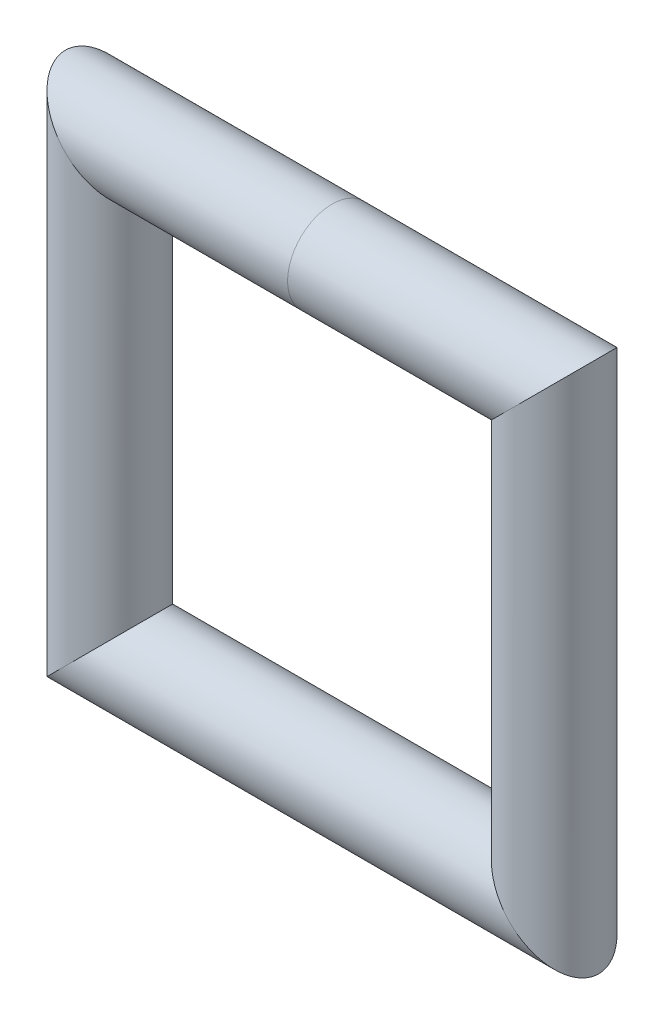
ISO-10303-21;
HEADER;
FILE_DESCRIPTION(('STEP AP214'),'2;1');
FILE_NAME('part.step','',(''),(''),'','','');
FILE_SCHEMA(('AUTOMOTIVE_DESIGN { 1 0 10303 214 1 1 1 1 }'));
ENDSEC;
DATA;
#1=APPLICATION_CONTEXT('core data for automotive mechanical design processes');
#2=APPLICATION_PROTOCOL_DEFINITION('international standard','automotive_design',2000,#1);
#3=PRODUCT_CONTEXT('',#1,'mechanical');
#4=PRODUCT('Part','Part','',(#3));
#5=PRODUCT_RELATED_PRODUCT_CATEGORY('part','',(#4));
#6=PRODUCT_DEFINITION_FORMATION('','',#4);
#7=PRODUCT_DEFINITION_CONTEXT('part definition',#1,'design');
#8=PRODUCT_DEFINITION('design','',#6,#7);
#9=PRODUCT_DEFINITION_SHAPE('','',#8);
#10=(LENGTH_UNIT() NAMED_UNIT(*) SI_UNIT(.MILLI.,.METRE.));
#11=(NAMED_UNIT(*) PLANE_ANGLE_UNIT() SI_UNIT($,.RADIAN.));
#12=(NAMED_UNIT(*) SI_UNIT($,.STERADIAN.) SOLID_ANGLE_UNIT());
#13=UNCERTAINTY_MEASURE_WITH_UNIT(LENGTH_MEASURE(1.E-05),#10,'distance_accuracy_value','');
#14=(GEOMETRIC_REPRESENTATION_CONTEXT(3) GLOBAL_UNCERTAINTY_ASSIGNED_CONTEXT((#13)) GLOBAL_UNIT_ASSIGNED_CONTEXT((#10,
#11,#12)) REPRESENTATION_CONTEXT('',''));
#15=CARTESIAN_POINT('',(0.,0.,0.));
#16=DIRECTION('',(0.,0.,1.));
#17=DIRECTION('',(1.,0.,0.));
#18=AXIS2_PLACEMENT_3D('',#15,#16,#17);
#19=CARTESIAN_POINT('',(-12.5,-25.,0.));
#20=DIRECTION('',(0.,1.,0.));
#21=DIRECTION('',(0.,0.,1.));
#22=AXIS2_PLACEMENT_3D('',#19,#20,#21);
#23=CYLINDRICAL_SURFACE('',#22,2.5);
#24=CARTESIAN_POINT('',(-12.5,-12.5,0.));
#25=DIRECTION('',(-0.707106781186548,0.707106781186548,0.));
#26=DIRECTION('',(-0.707106781186548,-0.707106781186548,0.));
#27=AXIS2_PLACEMENT_3D('',#24,#25,#26);
#28=ELLIPSE('',#27,3.53553390593274,2.5);
#29=CARTESIAN_POINT('',(-15.,-15.,0.));
#30=VERTEX_POINT('',#29);
#31=EDGE_CURVE('E57',#30,#30,#28,.F.);
#32=ORIENTED_EDGE('',*,*,#31,.F.);
#33=EDGE_LOOP('',(#32));
#34=FACE_BOUND('',#33,.T.);
#35=CARTESIAN_POINT('',(-12.5,12.5,0.));
#36=DIRECTION('',(0.707106781186547,0.707106781186547,0.));
#37=DIRECTION('',(0.707106781186548,-0.707106781186548,0.));
#38=AXIS2_PLACEMENT_3D('',#35,#36,#37);
#39=ELLIPSE('',#38,3.53553390593274,2.5);
#40=CARTESIAN_POINT('',(-10.,10.,0.));
#41=VERTEX_POINT('',#40);
#42=EDGE_CURVE('E62',#41,#41,#39,.F.);
#43=ORIENTED_EDGE('',*,*,#42,.T.);
#44=EDGE_LOOP('',(#43));
#45=FACE_BOUND('',#44,.T.);
#46=ADVANCED_FACE('F43',(#34,#45),#23,.T.);
#47=CARTESIAN_POINT('',(-25.,12.5,0.));
#48=DIRECTION('',(1.,0.,0.));
#49=DIRECTION('',(0.,0.,-1.));
#50=AXIS2_PLACEMENT_3D('',#47,#48,#49);
#51=CYLINDRICAL_SURFACE('',#50,2.5);
#52=ORIENTED_EDGE('',*,*,#42,.F.);
#53=EDGE_LOOP('',(#52));
#54=FACE_BOUND('',#53,.T.);
#55=CARTESIAN_POINT('',(0.,12.5,0.));
#56=DIRECTION('',(1.,0.,0.));
#57=DIRECTION('',(0.,0.,-1.));
#58=AXIS2_PLACEMENT_3D('',#55,#56,#57);
#59=CIRCLE('',#58,2.5);
#60=CARTESIAN_POINT('',(0.,12.5,-2.5));
#61=VERTEX_POINT('',#60);
#62=EDGE_CURVE('E46',#61,#61,#59,.T.);
#63=ORIENTED_EDGE('',*,*,#62,.F.);
#64=EDGE_LOOP('',(#63));
#65=FACE_BOUND('',#64,.T.);
#66=ADVANCED_FACE('F74',(#54,#65),#51,.T.);
#67=CARTESIAN_POINT('',(0.,12.5,0.));
#68=DIRECTION('',(1.,0.,0.));
#69=DIRECTION('',(0.,0.,-1.));
#70=AXIS2_PLACEMENT_3D('',#67,#68,#69);
#71=CYLINDRICAL_SURFACE('',#70,2.5);
#72=ORIENTED_EDGE('',*,*,#62,.T.);
#73=EDGE_LOOP('',(#72));
#74=FACE_BOUND('',#73,.T.);
#75=CARTESIAN_POINT('',(12.5,12.5,0.));
#76=DIRECTION('',(0.707106781186548,-0.707106781186548,0.));
#77=DIRECTION('',(-0.707106781186548,-0.707106781186548,0.));
#78=AXIS2_PLACEMENT_3D('',#75,#76,#77);
#79=ELLIPSE('',#78,3.53553390593274,2.5);
#80=CARTESIAN_POINT('',(9.99999999999998,9.99999999999999,0.));
#81=VERTEX_POINT('',#80);
#82=EDGE_CURVE('E51',#81,#81,#79,.F.);
#83=ORIENTED_EDGE('',*,*,#82,.T.);
#84=EDGE_LOOP('',(#83));
#85=FACE_BOUND('',#84,.T.);
#86=ADVANCED_FACE('F71',(#74,#85),#71,.T.);
#87=CARTESIAN_POINT('',(25.,-12.5,0.));
#88=DIRECTION('',(-1.,0.,0.));
#89=DIRECTION('',(0.,0.,1.));
#90=AXIS2_PLACEMENT_3D('',#87,#88,#89);
#91=CYLINDRICAL_SURFACE('',#90,2.5);
#92=CARTESIAN_POINT('',(12.5,-12.5,0.));
#93=DIRECTION('',(-0.707106781186548,-0.707106781186548,0.));
#94=DIRECTION('',(0.707106781186548,-0.707106781186548,0.));
#95=AXIS2_PLACEMENT_3D('',#92,#93,#94);
#96=ELLIPSE('',#95,3.53553390593274,2.5);
#97=CARTESIAN_POINT('',(15.,-15.,0.));
#98=VERTEX_POINT('',#97);
#99=EDGE_CURVE('E10',#98,#98,#96,.F.);
#100=ORIENTED_EDGE('',*,*,#99,.F.);
#101=EDGE_LOOP('',(#100));
#102=FACE_BOUND('',#101,.T.);
#103=ORIENTED_EDGE('',*,*,#31,.T.);
#104=EDGE_LOOP('',(#103));
#105=FACE_BOUND('',#104,.T.);
#106=ADVANCED_FACE('F82',(#102,#105),#91,.T.);
#107=CARTESIAN_POINT('',(12.5,25.,0.));
#108=DIRECTION('',(0.,-1.,0.));
#109=DIRECTION('',(0.,0.,-1.));
#110=AXIS2_PLACEMENT_3D('',#107,#108,#109);
#111=CYLINDRICAL_SURFACE('',#110,2.5);
#112=ORIENTED_EDGE('',*,*,#82,.F.);
#113=EDGE_LOOP('',(#112));
#114=FACE_BOUND('',#113,.T.);
#115=ORIENTED_EDGE('',*,*,#99,.T.);
#116=EDGE_LOOP('',(#115));
#117=FACE_BOUND('',#116,.T.);
#118=ADVANCED_FACE('F85',(#114,#117),#111,.T.);
#119=CLOSED_SHELL('',(#46,#66,#86,#106,#118));
#120=MANIFOLD_SOLID_BREP('B2',#119);
#121=ADVANCED_BREP_SHAPE_REPRESENTATION('',(#18,#120),#14);
#122=SHAPE_DEFINITION_REPRESENTATION(#9,#121);
ENDSEC;
END-ISO-10303-21;
